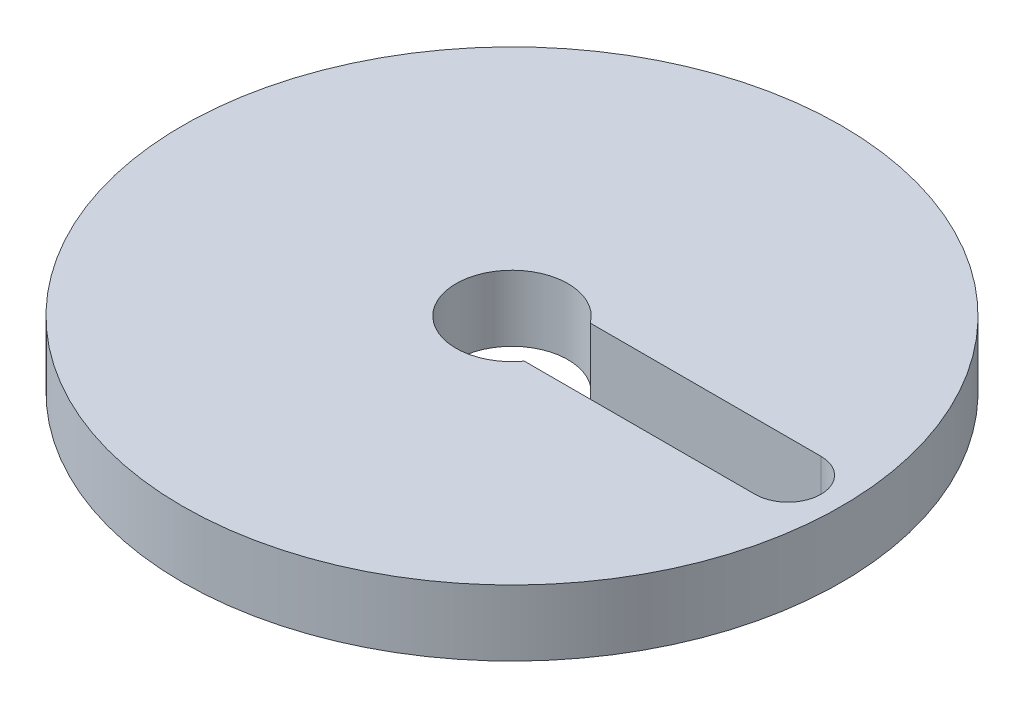
ISO-10303-21;
HEADER;
FILE_DESCRIPTION(('STEP AP214'),'2;1');
FILE_NAME('part.step','',(''),(''),'','','');
FILE_SCHEMA(('AUTOMOTIVE_DESIGN { 1 0 10303 214 1 1 1 1 }'));
ENDSEC;
DATA;
#1=APPLICATION_CONTEXT('core data for automotive mechanical design processes');
#2=APPLICATION_PROTOCOL_DEFINITION('international standard','automotive_design',2000,#1);
#3=PRODUCT_CONTEXT('',#1,'mechanical');
#4=PRODUCT('Part','Part','',(#3));
#5=PRODUCT_RELATED_PRODUCT_CATEGORY('part','',(#4));
#6=PRODUCT_DEFINITION_FORMATION('','',#4);
#7=PRODUCT_DEFINITION_CONTEXT('part definition',#1,'design');
#8=PRODUCT_DEFINITION('design','',#6,#7);
#9=PRODUCT_DEFINITION_SHAPE('','',#8);
#10=(LENGTH_UNIT() NAMED_UNIT(*) SI_UNIT(.MILLI.,.METRE.));
#11=(NAMED_UNIT(*) PLANE_ANGLE_UNIT() SI_UNIT($,.RADIAN.));
#12=(NAMED_UNIT(*) SI_UNIT($,.STERADIAN.) SOLID_ANGLE_UNIT());
#13=UNCERTAINTY_MEASURE_WITH_UNIT(LENGTH_MEASURE(1.E-05),#10,'distance_accuracy_value','');
#14=(GEOMETRIC_REPRESENTATION_CONTEXT(3) GLOBAL_UNCERTAINTY_ASSIGNED_CONTEXT((#13)) GLOBAL_UNIT_ASSIGNED_CONTEXT((#10,
#11,#12)) REPRESENTATION_CONTEXT('',''));
#15=CARTESIAN_POINT('',(0.,0.,0.));
#16=DIRECTION('',(0.,0.,1.));
#17=DIRECTION('',(1.,0.,0.));
#18=AXIS2_PLACEMENT_3D('',#15,#16,#17);
#19=CARTESIAN_POINT('',(0.,2.,-0.999999999999999));
#20=DIRECTION('',(0.,0.,1.));
#21=DIRECTION('',(1.,0.,0.));
#22=AXIS2_PLACEMENT_3D('',#19,#20,#21);
#23=PLANE('',#22);
#24=DIRECTION('',(-1.,0.,0.));
#25=VECTOR('',#24,1.);
#26=CARTESIAN_POINT('',(0.,0.,-0.999999999999999));
#27=LINE('',#26,#25);
#28=CARTESIAN_POINT('',(8.37477270848675,0.,-1.));
#29=VERTEX_POINT('',#28);
#30=CARTESIAN_POINT('',(1.37477270848675,0.,-0.999999999999999));
#31=VERTEX_POINT('',#30);
#32=EDGE_CURVE('E127',#29,#31,#27,.T.);
#33=ORIENTED_EDGE('',*,*,#32,.F.);
#34=DIRECTION('',(0.,-1.,0.));
#35=VECTOR('',#34,1.);
#36=CARTESIAN_POINT('',(8.37477270848675,2.,-1.));
#37=LINE('',#36,#35);
#38=CARTESIAN_POINT('',(8.37477270848675,2.,-1.));
#39=VERTEX_POINT('',#38);
#40=EDGE_CURVE('E11',#39,#29,#37,.T.);
#41=ORIENTED_EDGE('',*,*,#40,.F.);
#42=DIRECTION('',(-1.,0.,0.));
#43=VECTOR('',#42,1.);
#44=CARTESIAN_POINT('',(0.,2.,-0.999999999999999));
#45=LINE('',#44,#43);
#46=CARTESIAN_POINT('',(1.37477270848675,2.,-0.999999999999999));
#47=VERTEX_POINT('',#46);
#48=EDGE_CURVE('E104',#39,#47,#45,.T.);
#49=ORIENTED_EDGE('',*,*,#48,.T.);
#50=DIRECTION('',(0.,-1.,0.));
#51=VECTOR('',#50,1.);
#52=CARTESIAN_POINT('',(1.37477270848675,2.,-0.999999999999999));
#53=LINE('',#52,#51);
#54=EDGE_CURVE('E65',#47,#31,#53,.T.);
#55=ORIENTED_EDGE('',*,*,#54,.T.);
#56=EDGE_LOOP('',(#33,#41,#49,#55));
#57=FACE_BOUND('',#56,.T.);
#58=ADVANCED_FACE('F47',(#57),#23,.T.);
#59=CARTESIAN_POINT('',(8.37477270848675,2.,0.));
#60=DIRECTION('',(0.,-1.,0.));
#61=DIRECTION('',(0.,0.,-1.));
#62=AXIS2_PLACEMENT_3D('',#59,#60,#61);
#63=CYLINDRICAL_SURFACE('',#62,1.);
#64=CARTESIAN_POINT('',(8.37477270848675,0.,0.));
#65=DIRECTION('',(0.,1.,0.));
#66=DIRECTION('',(0.,0.,1.));
#67=AXIS2_PLACEMENT_3D('',#64,#65,#66);
#68=CIRCLE('',#67,1.);
#69=CARTESIAN_POINT('',(8.37477270848675,0.,1.));
#70=VERTEX_POINT('',#69);
#71=EDGE_CURVE('E110',#29,#70,#68,.F.);
#72=ORIENTED_EDGE('',*,*,#71,.T.);
#73=DIRECTION('',(0.,-1.,0.));
#74=VECTOR('',#73,1.);
#75=CARTESIAN_POINT('',(8.37477270848675,2.,1.));
#76=LINE('',#75,#74);
#77=CARTESIAN_POINT('',(8.37477270848675,2.,1.));
#78=VERTEX_POINT('',#77);
#79=EDGE_CURVE('E57',#78,#70,#76,.T.);
#80=ORIENTED_EDGE('',*,*,#79,.F.);
#81=CARTESIAN_POINT('',(8.37477270848675,2.,0.));
#82=DIRECTION('',(0.,1.,0.));
#83=DIRECTION('',(0.,0.,1.));
#84=AXIS2_PLACEMENT_3D('',#81,#82,#83);
#85=CIRCLE('',#84,1.);
#86=EDGE_CURVE('E100',#39,#78,#85,.F.);
#87=ORIENTED_EDGE('',*,*,#86,.F.);
#88=ORIENTED_EDGE('',*,*,#40,.T.);
#89=EDGE_LOOP('',(#72,#80,#87,#88));
#90=FACE_BOUND('',#89,.T.);
#91=ADVANCED_FACE('F108',(#90),#63,.F.);
#92=CARTESIAN_POINT('',(0.,2.,0.999999999999999));
#93=DIRECTION('',(0.,0.,1.));
#94=DIRECTION('',(1.,0.,0.));
#95=AXIS2_PLACEMENT_3D('',#92,#93,#94);
#96=PLANE('',#95);
#97=DIRECTION('',(-1.,0.,0.));
#98=VECTOR('',#97,1.);
#99=CARTESIAN_POINT('',(0.,0.,0.999999999999999));
#100=LINE('',#99,#98);
#101=CARTESIAN_POINT('',(1.37477270848675,0.,0.999999999999999));
#102=VERTEX_POINT('',#101);
#103=EDGE_CURVE('E122',#70,#102,#100,.T.);
#104=ORIENTED_EDGE('',*,*,#103,.T.);
#105=DIRECTION('',(0.,-1.,0.));
#106=VECTOR('',#105,1.);
#107=CARTESIAN_POINT('',(1.37477270848675,2.,0.999999999999999));
#108=LINE('',#107,#106);
#109=CARTESIAN_POINT('',(1.37477270848675,2.,0.999999999999999));
#110=VERTEX_POINT('',#109);
#111=EDGE_CURVE('E79',#110,#102,#108,.T.);
#112=ORIENTED_EDGE('',*,*,#111,.F.);
#113=DIRECTION('',(-1.,0.,0.));
#114=VECTOR('',#113,1.);
#115=CARTESIAN_POINT('',(0.,2.,0.999999999999999));
#116=LINE('',#115,#114);
#117=EDGE_CURVE('E91',#78,#110,#116,.T.);
#118=ORIENTED_EDGE('',*,*,#117,.F.);
#119=ORIENTED_EDGE('',*,*,#79,.T.);
#120=EDGE_LOOP('',(#104,#112,#118,#119));
#121=FACE_BOUND('',#120,.T.);
#122=ADVANCED_FACE('F93',(#121),#96,.F.);
#123=CARTESIAN_POINT('',(0.,2.,0.));
#124=DIRECTION('',(0.,-1.,0.));
#125=DIRECTION('',(0.,0.,-1.));
#126=AXIS2_PLACEMENT_3D('',#123,#124,#125);
#127=CYLINDRICAL_SURFACE('',#126,10.);
#128=CARTESIAN_POINT('',(0.,2.,0.));
#129=DIRECTION('',(0.,1.,0.));
#130=DIRECTION('',(0.,0.,1.));
#131=AXIS2_PLACEMENT_3D('',#128,#129,#130);
#132=CIRCLE('',#131,10.);
#133=CARTESIAN_POINT('',(0.,2.,10.));
#134=VERTEX_POINT('',#133);
#135=EDGE_CURVE('E121',#134,#134,#132,.T.);
#136=ORIENTED_EDGE('',*,*,#135,.F.);
#137=EDGE_LOOP('',(#136));
#138=FACE_BOUND('',#137,.T.);
#139=CARTESIAN_POINT('',(0.,0.,0.));
#140=DIRECTION('',(0.,1.,0.));
#141=DIRECTION('',(0.,0.,1.));
#142=AXIS2_PLACEMENT_3D('',#139,#140,#141);
#143=CIRCLE('',#142,10.);
#144=CARTESIAN_POINT('',(0.,0.,10.));
#145=VERTEX_POINT('',#144);
#146=EDGE_CURVE('E130',#145,#145,#143,.T.);
#147=ORIENTED_EDGE('',*,*,#146,.T.);
#148=EDGE_LOOP('',(#147));
#149=FACE_BOUND('',#148,.T.);
#150=ADVANCED_FACE('F49',(#138,#149),#127,.T.);
#151=CARTESIAN_POINT('',(0.,2.,0.));
#152=DIRECTION('',(0.,-1.,0.));
#153=DIRECTION('',(0.,0.,-1.));
#154=AXIS2_PLACEMENT_3D('',#151,#152,#153);
#155=CYLINDRICAL_SURFACE('',#154,1.7);
#156=CARTESIAN_POINT('',(0.,0.,0.));
#157=DIRECTION('',(0.,1.,0.));
#158=DIRECTION('',(0.,0.,1.));
#159=AXIS2_PLACEMENT_3D('',#156,#157,#158);
#160=CIRCLE('',#159,1.7);
#161=EDGE_CURVE('E117',#31,#102,#160,.T.);
#162=ORIENTED_EDGE('',*,*,#161,.F.);
#163=ORIENTED_EDGE('',*,*,#54,.F.);
#164=CARTESIAN_POINT('',(0.,2.,0.));
#165=DIRECTION('',(0.,1.,0.));
#166=DIRECTION('',(0.,0.,1.));
#167=AXIS2_PLACEMENT_3D('',#164,#165,#166);
#168=CIRCLE('',#167,1.7);
#169=EDGE_CURVE('E99',#47,#110,#168,.T.);
#170=ORIENTED_EDGE('',*,*,#169,.T.);
#171=ORIENTED_EDGE('',*,*,#111,.T.);
#172=EDGE_LOOP('',(#162,#163,#170,#171));
#173=FACE_BOUND('',#172,.T.);
#174=ADVANCED_FACE('F145',(#173),#155,.F.);
#175=CARTESIAN_POINT('',(0.,2.,0.));
#176=DIRECTION('',(0.,1.,0.));
#177=DIRECTION('',(0.,0.,1.));
#178=AXIS2_PLACEMENT_3D('',#175,#176,#177);
#179=PLANE('',#178);
#180=ORIENTED_EDGE('',*,*,#135,.T.);
#181=EDGE_LOOP('',(#180));
#182=FACE_BOUND('',#181,.T.);
#183=ORIENTED_EDGE('',*,*,#48,.F.);
#184=ORIENTED_EDGE('',*,*,#86,.T.);
#185=ORIENTED_EDGE('',*,*,#117,.T.);
#186=ORIENTED_EDGE('',*,*,#169,.F.);
#187=EDGE_LOOP('',(#183,#184,#185,#186));
#188=FACE_BOUND('',#187,.T.);
#189=ADVANCED_FACE('F103',(#182,#188),#179,.T.);
#190=CARTESIAN_POINT('',(0.,0.,0.));
#191=DIRECTION('',(0.,1.,0.));
#192=DIRECTION('',(0.,0.,1.));
#193=AXIS2_PLACEMENT_3D('',#190,#191,#192);
#194=PLANE('',#193);
#195=ORIENTED_EDGE('',*,*,#146,.F.);
#196=EDGE_LOOP('',(#195));
#197=FACE_BOUND('',#196,.T.);
#198=ORIENTED_EDGE('',*,*,#32,.T.);
#199=ORIENTED_EDGE('',*,*,#161,.T.);
#200=ORIENTED_EDGE('',*,*,#103,.F.);
#201=ORIENTED_EDGE('',*,*,#71,.F.);
#202=EDGE_LOOP('',(#198,#199,#200,#201));
#203=FACE_BOUND('',#202,.T.);
#204=ADVANCED_FACE('F148',(#197,#203),#194,.F.);
#205=CLOSED_SHELL('',(#58,#91,#122,#150,#174,#189,#204));
#206=MANIFOLD_SOLID_BREP('B2',#205);
#207=ADVANCED_BREP_SHAPE_REPRESENTATION('',(#18,#206),#14);
#208=SHAPE_DEFINITION_REPRESENTATION(#9,#207);
ENDSEC;
END-ISO-10303-21;
